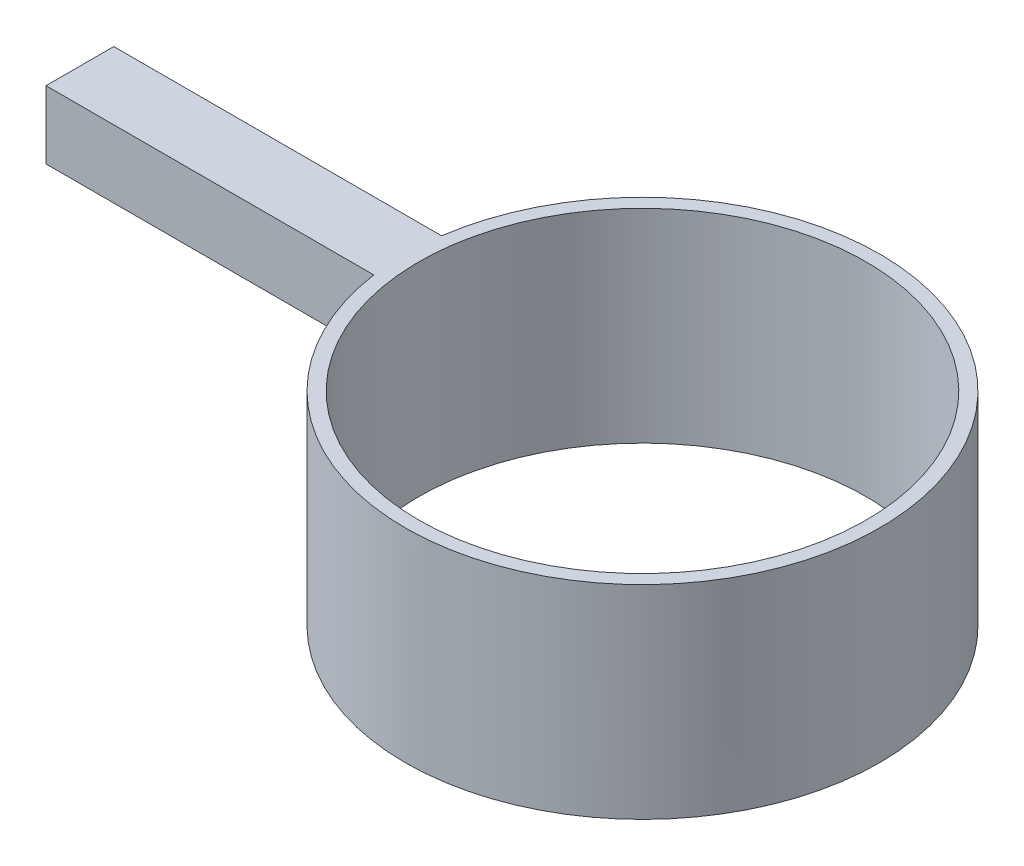
ISO-10303-21;
HEADER;
FILE_DESCRIPTION(('STEP AP214'),'2;1');
FILE_NAME('part.step','',(''),(''),'','','');
FILE_SCHEMA(('AUTOMOTIVE_DESIGN { 1 0 10303 214 1 1 1 1 }'));
ENDSEC;
DATA;
#1=APPLICATION_CONTEXT('core data for automotive mechanical design processes');
#2=APPLICATION_PROTOCOL_DEFINITION('international standard','automotive_design',2000,#1);
#3=PRODUCT_CONTEXT('',#1,'mechanical');
#4=PRODUCT('Part','Part','',(#3));
#5=PRODUCT_RELATED_PRODUCT_CATEGORY('part','',(#4));
#6=PRODUCT_DEFINITION_FORMATION('','',#4);
#7=PRODUCT_DEFINITION_CONTEXT('part definition',#1,'design');
#8=PRODUCT_DEFINITION('design','',#6,#7);
#9=PRODUCT_DEFINITION_SHAPE('','',#8);
#10=(LENGTH_UNIT() NAMED_UNIT(*) SI_UNIT(.MILLI.,.METRE.));
#11=(NAMED_UNIT(*) PLANE_ANGLE_UNIT() SI_UNIT($,.RADIAN.));
#12=(NAMED_UNIT(*) SI_UNIT($,.STERADIAN.) SOLID_ANGLE_UNIT());
#13=UNCERTAINTY_MEASURE_WITH_UNIT(LENGTH_MEASURE(1.E-05),#10,'distance_accuracy_value','');
#14=(GEOMETRIC_REPRESENTATION_CONTEXT(3) GLOBAL_UNCERTAINTY_ASSIGNED_CONTEXT((#13)) GLOBAL_UNIT_ASSIGNED_CONTEXT((#10,
#11,#12)) REPRESENTATION_CONTEXT('',''));
#15=CARTESIAN_POINT('',(0.,0.,0.));
#16=DIRECTION('',(0.,0.,1.));
#17=DIRECTION('',(1.,0.,0.));
#18=AXIS2_PLACEMENT_3D('',#15,#16,#17);
#19=CARTESIAN_POINT('',(0.,30.,0.));
#20=DIRECTION('',(0.,1.,0.));
#21=DIRECTION('',(0.,0.,1.));
#22=AXIS2_PLACEMENT_3D('',#19,#20,#21);
#23=PLANE('',#22);
#24=CARTESIAN_POINT('',(0.,30.,0.));
#25=DIRECTION('',(0.,1.,0.));
#26=DIRECTION('',(0.,0.,1.));
#27=AXIS2_PLACEMENT_3D('',#24,#25,#26);
#28=CIRCLE('',#27,33.);
#29=CARTESIAN_POINT('',(0.,30.,33.));
#30=VERTEX_POINT('',#29);
#31=EDGE_CURVE('E124',#30,#30,#28,.T.);
#32=ORIENTED_EDGE('',*,*,#31,.F.);
#33=EDGE_LOOP('',(#32));
#34=FACE_BOUND('',#33,.T.);
#35=DIRECTION('',(1.,0.,0.));
#36=VECTOR('',#35,1.);
#37=CARTESIAN_POINT('',(-33.,30.,5.));
#38=LINE('',#37,#36);
#39=CARTESIAN_POINT('',(-83.,30.,5.00000000000001));
#40=VERTEX_POINT('',#39);
#41=CARTESIAN_POINT('',(-34.6410161513775,30.,5.));
#42=VERTEX_POINT('',#41);
#43=EDGE_CURVE('E61',#40,#42,#38,.T.);
#44=ORIENTED_EDGE('',*,*,#43,.T.);
#45=CARTESIAN_POINT('',(0.,30.,0.));
#46=DIRECTION('',(0.,1.,0.));
#47=DIRECTION('',(0.,0.,1.));
#48=AXIS2_PLACEMENT_3D('',#45,#46,#47);
#49=CIRCLE('',#48,35.);
#50=CARTESIAN_POINT('',(-34.6410161513775,30.,-5.));
#51=VERTEX_POINT('',#50);
#52=EDGE_CURVE('E132',#42,#51,#49,.T.);
#53=ORIENTED_EDGE('',*,*,#52,.T.);
#54=DIRECTION('',(-1.,0.,0.));
#55=VECTOR('',#54,1.);
#56=CARTESIAN_POINT('',(-33.,30.,-5.));
#57=LINE('',#56,#55);
#58=CARTESIAN_POINT('',(-83.,30.,-4.99999999999999));
#59=VERTEX_POINT('',#58);
#60=EDGE_CURVE('E113',#51,#59,#57,.T.);
#61=ORIENTED_EDGE('',*,*,#60,.T.);
#62=DIRECTION('',(0.,0.,1.));
#63=VECTOR('',#62,1.);
#64=CARTESIAN_POINT('',(-83.,30.,-4.99999999999999));
#65=LINE('',#64,#63);
#66=EDGE_CURVE('E103',#59,#40,#65,.T.);
#67=ORIENTED_EDGE('',*,*,#66,.T.);
#68=EDGE_LOOP('',(#44,#53,#61,#67));
#69=FACE_BOUND('',#68,.T.);
#70=ADVANCED_FACE('F43',(#34,#69),#23,.T.);
#71=CARTESIAN_POINT('',(0.,0.,0.));
#72=DIRECTION('',(0.,1.,0.));
#73=DIRECTION('',(0.,0.,1.));
#74=AXIS2_PLACEMENT_3D('',#71,#72,#73);
#75=PLANE('',#74);
#76=CARTESIAN_POINT('',(0.,0.,0.));
#77=DIRECTION('',(0.,1.,0.));
#78=DIRECTION('',(0.,0.,1.));
#79=AXIS2_PLACEMENT_3D('',#76,#77,#78);
#80=CIRCLE('',#79,35.);
#81=CARTESIAN_POINT('',(0.,0.,35.));
#82=VERTEX_POINT('',#81);
#83=EDGE_CURVE('E128',#82,#82,#80,.T.);
#84=ORIENTED_EDGE('',*,*,#83,.F.);
#85=EDGE_LOOP('',(#84));
#86=FACE_BOUND('',#85,.T.);
#87=CARTESIAN_POINT('',(0.,0.,0.));
#88=DIRECTION('',(0.,1.,0.));
#89=DIRECTION('',(0.,0.,1.));
#90=AXIS2_PLACEMENT_3D('',#87,#88,#89);
#91=CIRCLE('',#90,33.);
#92=CARTESIAN_POINT('',(0.,0.,33.));
#93=VERTEX_POINT('',#92);
#94=EDGE_CURVE('E123',#93,#93,#91,.T.);
#95=ORIENTED_EDGE('',*,*,#94,.T.);
#96=EDGE_LOOP('',(#95));
#97=FACE_BOUND('',#96,.T.);
#98=ADVANCED_FACE('F156',(#86,#97),#75,.F.);
#99=CARTESIAN_POINT('',(0.,30.,0.));
#100=DIRECTION('',(0.,-1.,0.));
#101=DIRECTION('',(0.,0.,-1.));
#102=AXIS2_PLACEMENT_3D('',#99,#100,#101);
#103=CYLINDRICAL_SURFACE('',#102,35.);
#104=ORIENTED_EDGE('',*,*,#52,.F.);
#105=DIRECTION('',(0.,-1.,0.));
#106=VECTOR('',#105,1.);
#107=CARTESIAN_POINT('',(-34.6410161513775,30.,5.));
#108=LINE('',#107,#106);
#109=CARTESIAN_POINT('',(-34.6410161513775,20.,5.));
#110=VERTEX_POINT('',#109);
#111=EDGE_CURVE('E11',#42,#110,#108,.T.);
#112=ORIENTED_EDGE('',*,*,#111,.T.);
#113=CARTESIAN_POINT('',(0.,20.,0.));
#114=DIRECTION('',(0.,-1.,0.));
#115=DIRECTION('',(0.,0.,-1.));
#116=AXIS2_PLACEMENT_3D('',#113,#114,#115);
#117=CIRCLE('',#116,35.);
#118=CARTESIAN_POINT('',(-34.6410161513775,20.,-5.));
#119=VERTEX_POINT('',#118);
#120=EDGE_CURVE('E119',#110,#119,#117,.T.);
#121=ORIENTED_EDGE('',*,*,#120,.T.);
#122=DIRECTION('',(0.,-1.,0.));
#123=VECTOR('',#122,1.);
#124=CARTESIAN_POINT('',(-34.6410161513775,30.,-5.));
#125=LINE('',#124,#123);
#126=EDGE_CURVE('E52',#119,#51,#125,.F.);
#127=ORIENTED_EDGE('',*,*,#126,.T.);
#128=EDGE_LOOP('',(#104,#112,#121,#127));
#129=FACE_BOUND('',#128,.T.);
#130=ORIENTED_EDGE('',*,*,#83,.T.);
#131=EDGE_LOOP('',(#130));
#132=FACE_BOUND('',#131,.T.);
#133=ADVANCED_FACE('F45',(#129,#132),#103,.T.);
#134=CARTESIAN_POINT('',(0.,30.,0.));
#135=DIRECTION('',(0.,-1.,0.));
#136=DIRECTION('',(0.,0.,-1.));
#137=AXIS2_PLACEMENT_3D('',#134,#135,#136);
#138=CYLINDRICAL_SURFACE('',#137,33.);
#139=ORIENTED_EDGE('',*,*,#31,.T.);
#140=EDGE_LOOP('',(#139));
#141=FACE_BOUND('',#140,.T.);
#142=ORIENTED_EDGE('',*,*,#94,.F.);
#143=EDGE_LOOP('',(#142));
#144=FACE_BOUND('',#143,.T.);
#145=ADVANCED_FACE('F144',(#141,#144),#138,.F.);
#146=CARTESIAN_POINT('',(-33.,20.,5.));
#147=DIRECTION('',(0.,0.,1.));
#148=DIRECTION('',(1.,0.,0.));
#149=AXIS2_PLACEMENT_3D('',#146,#147,#148);
#150=PLANE('',#149);
#151=ORIENTED_EDGE('',*,*,#111,.F.);
#152=ORIENTED_EDGE('',*,*,#43,.F.);
#153=DIRECTION('',(0.,1.,0.));
#154=VECTOR('',#153,1.);
#155=CARTESIAN_POINT('',(-83.,20.,5.00000000000001));
#156=LINE('',#155,#154);
#157=CARTESIAN_POINT('',(-83.,20.,5.00000000000001));
#158=VERTEX_POINT('',#157);
#159=EDGE_CURVE('E104',#158,#40,#156,.T.);
#160=ORIENTED_EDGE('',*,*,#159,.F.);
#161=DIRECTION('',(1.,0.,0.));
#162=VECTOR('',#161,1.);
#163=CARTESIAN_POINT('',(-33.,20.,5.));
#164=LINE('',#163,#162);
#165=EDGE_CURVE('E105',#158,#110,#164,.T.);
#166=ORIENTED_EDGE('',*,*,#165,.T.);
#167=EDGE_LOOP('',(#151,#152,#160,#166));
#168=FACE_BOUND('',#167,.T.);
#169=ADVANCED_FACE('F142',(#168),#150,.T.);
#170=CARTESIAN_POINT('',(-33.,20.,-5.));
#171=DIRECTION('',(0.,0.,-1.));
#172=DIRECTION('',(-1.,0.,0.));
#173=AXIS2_PLACEMENT_3D('',#170,#171,#172);
#174=PLANE('',#173);
#175=ORIENTED_EDGE('',*,*,#126,.F.);
#176=DIRECTION('',(-1.,0.,0.));
#177=VECTOR('',#176,1.);
#178=CARTESIAN_POINT('',(-33.,20.,-5.));
#179=LINE('',#178,#177);
#180=CARTESIAN_POINT('',(-83.,20.,-4.99999999999999));
#181=VERTEX_POINT('',#180);
#182=EDGE_CURVE('E88',#119,#181,#179,.T.);
#183=ORIENTED_EDGE('',*,*,#182,.T.);
#184=DIRECTION('',(0.,1.,0.));
#185=VECTOR('',#184,1.);
#186=CARTESIAN_POINT('',(-83.,20.,-4.99999999999999));
#187=LINE('',#186,#185);
#188=EDGE_CURVE('E91',#181,#59,#187,.T.);
#189=ORIENTED_EDGE('',*,*,#188,.T.);
#190=ORIENTED_EDGE('',*,*,#60,.F.);
#191=EDGE_LOOP('',(#175,#183,#189,#190));
#192=FACE_BOUND('',#191,.T.);
#193=ADVANCED_FACE('F90',(#192),#174,.T.);
#194=CARTESIAN_POINT('',(-83.,20.,-4.99999999999999));
#195=DIRECTION('',(-1.,0.,0.));
#196=DIRECTION('',(0.,0.,1.));
#197=AXIS2_PLACEMENT_3D('',#194,#195,#196);
#198=PLANE('',#197);
#199=ORIENTED_EDGE('',*,*,#66,.F.);
#200=ORIENTED_EDGE('',*,*,#188,.F.);
#201=DIRECTION('',(0.,0.,1.));
#202=VECTOR('',#201,1.);
#203=CARTESIAN_POINT('',(-83.,20.,-4.99999999999999));
#204=LINE('',#203,#202);
#205=EDGE_CURVE('E97',#181,#158,#204,.T.);
#206=ORIENTED_EDGE('',*,*,#205,.T.);
#207=ORIENTED_EDGE('',*,*,#159,.T.);
#208=EDGE_LOOP('',(#199,#200,#206,#207));
#209=FACE_BOUND('',#208,.T.);
#210=ADVANCED_FACE('F101',(#209),#198,.T.);
#211=CARTESIAN_POINT('',(0.,20.,0.));
#212=DIRECTION('',(0.,-1.,0.));
#213=DIRECTION('',(0.,0.,-1.));
#214=AXIS2_PLACEMENT_3D('',#211,#212,#213);
#215=PLANE('',#214);
#216=ORIENTED_EDGE('',*,*,#120,.F.);
#217=ORIENTED_EDGE('',*,*,#165,.F.);
#218=ORIENTED_EDGE('',*,*,#205,.F.);
#219=ORIENTED_EDGE('',*,*,#182,.F.);
#220=EDGE_LOOP('',(#216,#217,#218,#219));
#221=FACE_BOUND('',#220,.T.);
#222=ADVANCED_FACE('F107',(#221),#215,.T.);
#223=CLOSED_SHELL('',(#70,#98,#133,#145,#169,#193,#210,#222));
#224=MANIFOLD_SOLID_BREP('B2',#223);
#225=ADVANCED_BREP_SHAPE_REPRESENTATION('',(#18,#224),#14);
#226=SHAPE_DEFINITION_REPRESENTATION(#9,#225);
ENDSEC;
END-ISO-10303-21;
